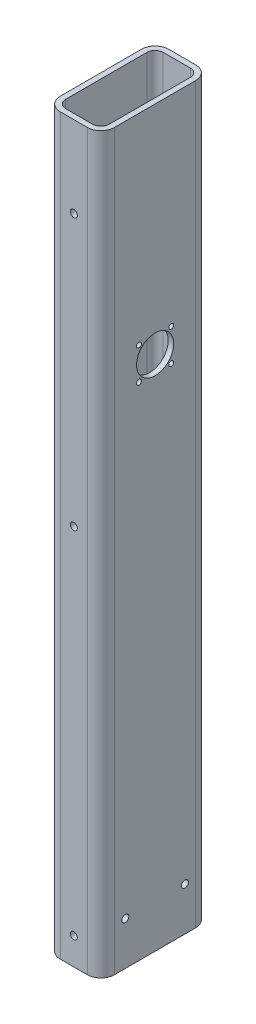
ISO-10303-21;
HEADER;
FILE_DESCRIPTION(('STEP AP214'),'2;1');
FILE_NAME('part.step','',(''),(''),'','','');
FILE_SCHEMA(('AUTOMOTIVE_DESIGN { 1 0 10303 214 1 1 1 1 }'));
ENDSEC;
DATA;
#1=APPLICATION_CONTEXT('core data for automotive mechanical design processes');
#2=APPLICATION_PROTOCOL_DEFINITION('international standard','automotive_design',2000,#1);
#3=PRODUCT_CONTEXT('',#1,'mechanical');
#4=PRODUCT('Part','Part','',(#3));
#5=PRODUCT_RELATED_PRODUCT_CATEGORY('part','',(#4));
#6=PRODUCT_DEFINITION_FORMATION('','',#4);
#7=PRODUCT_DEFINITION_CONTEXT('part definition',#1,'design');
#8=PRODUCT_DEFINITION('design','',#6,#7);
#9=PRODUCT_DEFINITION_SHAPE('','',#8);
#10=(LENGTH_UNIT() NAMED_UNIT(*) SI_UNIT(.MILLI.,.METRE.));
#11=(NAMED_UNIT(*) PLANE_ANGLE_UNIT() SI_UNIT($,.RADIAN.));
#12=(NAMED_UNIT(*) SI_UNIT($,.STERADIAN.) SOLID_ANGLE_UNIT());
#13=UNCERTAINTY_MEASURE_WITH_UNIT(LENGTH_MEASURE(1.E-05),#10,'distance_accuracy_value','');
#14=(GEOMETRIC_REPRESENTATION_CONTEXT(3) GLOBAL_UNCERTAINTY_ASSIGNED_CONTEXT((#13)) GLOBAL_UNIT_ASSIGNED_CONTEXT((#10,
#11,#12)) REPRESENTATION_CONTEXT('',''));
#15=CARTESIAN_POINT('',(0.,0.,0.));
#16=DIRECTION('',(0.,0.,1.));
#17=DIRECTION('',(1.,0.,0.));
#18=AXIS2_PLACEMENT_3D('',#15,#16,#17);
#19=CARTESIAN_POINT('',(12.4999999999999,338.5,37.5));
#20=DIRECTION('',(0.,-1.,0.));
#21=DIRECTION('',(1.,0.,0.));
#22=AXIS2_PLACEMENT_3D('',#19,#20,#21);
#23=CYLINDRICAL_SURFACE('',#22,7.5);
#24=CARTESIAN_POINT('',(12.5,-338.5,37.5));
#25=DIRECTION('',(0.,1.,0.));
#26=DIRECTION('',(1.,0.,0.));
#27=AXIS2_PLACEMENT_3D('',#24,#25,#26);
#28=CIRCLE('',#27,7.5);
#29=CARTESIAN_POINT('',(12.5,-338.5,45.));
#30=VERTEX_POINT('',#29);
#31=CARTESIAN_POINT('',(20.,-338.5,37.5));
#32=VERTEX_POINT('',#31);
#33=EDGE_CURVE('E229',#30,#32,#28,.T.);
#34=ORIENTED_EDGE('',*,*,#33,.F.);
#35=DIRECTION('',(0.,-1.,0.));
#36=VECTOR('',#35,1.);
#37=CARTESIAN_POINT('',(12.4999999999999,338.5,45.));
#38=LINE('',#37,#36);
#39=CARTESIAN_POINT('',(12.4999999999999,338.5,45.));
#40=VERTEX_POINT('',#39);
#41=EDGE_CURVE('E12',#40,#30,#38,.T.);
#42=ORIENTED_EDGE('',*,*,#41,.F.);
#43=CARTESIAN_POINT('',(12.4999999999999,338.5,37.5));
#44=DIRECTION('',(0.,1.,0.));
#45=DIRECTION('',(1.,0.,0.));
#46=AXIS2_PLACEMENT_3D('',#43,#44,#45);
#47=CIRCLE('',#46,7.5);
#48=CARTESIAN_POINT('',(19.9999999999999,338.5,37.5));
#49=VERTEX_POINT('',#48);
#50=EDGE_CURVE('E380',#40,#49,#47,.T.);
#51=ORIENTED_EDGE('',*,*,#50,.T.);
#52=DIRECTION('',(0.,-1.,0.));
#53=VECTOR('',#52,1.);
#54=CARTESIAN_POINT('',(19.9999999999999,338.5,37.5));
#55=LINE('',#54,#53);
#56=EDGE_CURVE('E80',#49,#32,#55,.T.);
#57=ORIENTED_EDGE('',*,*,#56,.T.);
#58=EDGE_LOOP('',(#34,#42,#51,#57));
#59=FACE_BOUND('',#58,.T.);
#60=ADVANCED_FACE('F61',(#59),#23,.F.);
#61=CARTESIAN_POINT('',(12.4999999999999,338.5,45.));
#62=DIRECTION('',(0.,0.,-1.));
#63=DIRECTION('',(-1.,0.,0.));
#64=AXIS2_PLACEMENT_3D('',#61,#62,#63);
#65=PLANE('',#64);
#66=CARTESIAN_POINT('',(0.,-313.5,45.));
#67=DIRECTION('',(0.,0.,-1.));
#68=DIRECTION('',(-1.,0.,0.));
#69=AXIS2_PLACEMENT_3D('',#66,#67,#68);
#70=CIRCLE('',#69,3.25);
#71=CARTESIAN_POINT('',(-3.25,-313.5,45.));
#72=VERTEX_POINT('',#71);
#73=EDGE_CURVE('E315',#72,#72,#70,.T.);
#74=ORIENTED_EDGE('',*,*,#73,.F.);
#75=EDGE_LOOP('',(#74));
#76=FACE_BOUND('',#75,.T.);
#77=CARTESIAN_POINT('',(0.,263.5,45.));
#78=DIRECTION('',(0.,0.,-1.));
#79=DIRECTION('',(-1.,0.,0.));
#80=AXIS2_PLACEMENT_3D('',#77,#78,#79);
#81=CIRCLE('',#80,3.25);
#82=CARTESIAN_POINT('',(-3.25,263.5,45.));
#83=VERTEX_POINT('',#82);
#84=EDGE_CURVE('E215',#83,#83,#81,.T.);
#85=ORIENTED_EDGE('',*,*,#84,.F.);
#86=EDGE_LOOP('',(#85));
#87=FACE_BOUND('',#86,.T.);
#88=CARTESIAN_POINT('',(0.,13.5,45.));
#89=DIRECTION('',(0.,0.,-1.));
#90=DIRECTION('',(-1.,0.,0.));
#91=AXIS2_PLACEMENT_3D('',#88,#89,#90);
#92=CIRCLE('',#91,3.25);
#93=CARTESIAN_POINT('',(-3.25,13.5,45.));
#94=VERTEX_POINT('',#93);
#95=EDGE_CURVE('E358',#94,#94,#92,.T.);
#96=ORIENTED_EDGE('',*,*,#95,.F.);
#97=EDGE_LOOP('',(#96));
#98=FACE_BOUND('',#97,.T.);
#99=DIRECTION('',(1.,0.,0.));
#100=VECTOR('',#99,1.);
#101=CARTESIAN_POINT('',(12.5,-338.5,45.));
#102=LINE('',#101,#100);
#103=CARTESIAN_POINT('',(-12.5,-338.5,45.));
#104=VERTEX_POINT('',#103);
#105=EDGE_CURVE('E231',#104,#30,#102,.T.);
#106=ORIENTED_EDGE('',*,*,#105,.F.);
#107=DIRECTION('',(0.,-1.,0.));
#108=VECTOR('',#107,1.);
#109=CARTESIAN_POINT('',(-12.5000000000001,338.5,45.));
#110=LINE('',#109,#108);
#111=CARTESIAN_POINT('',(-12.5000000000001,338.5,45.));
#112=VERTEX_POINT('',#111);
#113=EDGE_CURVE('E71',#112,#104,#110,.T.);
#114=ORIENTED_EDGE('',*,*,#113,.F.);
#115=DIRECTION('',(1.,0.,0.));
#116=VECTOR('',#115,1.);
#117=CARTESIAN_POINT('',(12.4999999999999,338.5,45.));
#118=LINE('',#117,#116);
#119=EDGE_CURVE('E382',#112,#40,#118,.T.);
#120=ORIENTED_EDGE('',*,*,#119,.T.);
#121=ORIENTED_EDGE('',*,*,#41,.T.);
#122=EDGE_LOOP('',(#106,#114,#120,#121));
#123=FACE_BOUND('',#122,.T.);
#124=ADVANCED_FACE('F417',(#76,#87,#98,#123),#65,.T.);
#125=CARTESIAN_POINT('',(-12.5000000000001,338.5,37.5));
#126=DIRECTION('',(0.,-1.,0.));
#127=DIRECTION('',(1.,0.,0.));
#128=AXIS2_PLACEMENT_3D('',#125,#126,#127);
#129=CYLINDRICAL_SURFACE('',#128,7.5);
#130=CARTESIAN_POINT('',(-12.5,-338.5,37.5));
#131=DIRECTION('',(0.,1.,0.));
#132=DIRECTION('',(1.,0.,0.));
#133=AXIS2_PLACEMENT_3D('',#130,#131,#132);
#134=CIRCLE('',#133,7.5);
#135=CARTESIAN_POINT('',(-20.,-338.5,37.5));
#136=VERTEX_POINT('',#135);
#137=EDGE_CURVE('E234',#136,#104,#134,.T.);
#138=ORIENTED_EDGE('',*,*,#137,.F.);
#139=DIRECTION('',(0.,-1.,0.));
#140=VECTOR('',#139,1.);
#141=CARTESIAN_POINT('',(-20.0000000000001,338.5,37.5));
#142=LINE('',#141,#140);
#143=CARTESIAN_POINT('',(-20.0000000000001,338.5,37.5));
#144=VERTEX_POINT('',#143);
#145=EDGE_CURVE('E256',#144,#136,#142,.T.);
#146=ORIENTED_EDGE('',*,*,#145,.F.);
#147=CARTESIAN_POINT('',(-12.5000000000001,338.5,37.5));
#148=DIRECTION('',(0.,1.,0.));
#149=DIRECTION('',(1.,0.,0.));
#150=AXIS2_PLACEMENT_3D('',#147,#148,#149);
#151=CIRCLE('',#150,7.5);
#152=EDGE_CURVE('E385',#144,#112,#151,.T.);
#153=ORIENTED_EDGE('',*,*,#152,.T.);
#154=ORIENTED_EDGE('',*,*,#113,.T.);
#155=EDGE_LOOP('',(#138,#146,#153,#154));
#156=FACE_BOUND('',#155,.T.);
#157=ADVANCED_FACE('F423',(#156),#129,.F.);
#158=CARTESIAN_POINT('',(-20.0000000000001,338.5,-37.5));
#159=DIRECTION('',(1.,0.,0.));
#160=DIRECTION('',(0.,1.,0.));
#161=AXIS2_PLACEMENT_3D('',#158,#159,#160);
#162=PLANE('',#161);
#163=CARTESIAN_POINT('',(-20.,-298.5,-27.5));
#164=DIRECTION('',(1.,0.,0.));
#165=DIRECTION('',(0.,1.,0.));
#166=AXIS2_PLACEMENT_3D('',#163,#164,#165);
#167=CIRCLE('',#166,3.25);
#168=CARTESIAN_POINT('',(-20.,-295.25,-27.5));
#169=VERTEX_POINT('',#168);
#170=EDGE_CURVE('E323',#169,#169,#167,.T.);
#171=ORIENTED_EDGE('',*,*,#170,.F.);
#172=EDGE_LOOP('',(#171));
#173=FACE_BOUND('',#172,.T.);
#174=CARTESIAN_POINT('',(-20.,-298.5,27.5));
#175=DIRECTION('',(1.,0.,0.));
#176=DIRECTION('',(0.,1.,0.));
#177=AXIS2_PLACEMENT_3D('',#174,#175,#176);
#178=CIRCLE('',#177,3.25);
#179=CARTESIAN_POINT('',(-20.,-295.25,27.5));
#180=VERTEX_POINT('',#179);
#181=EDGE_CURVE('E300',#180,#180,#178,.T.);
#182=ORIENTED_EDGE('',*,*,#181,.F.);
#183=EDGE_LOOP('',(#182));
#184=FACE_BOUND('',#183,.T.);
#185=CARTESIAN_POINT('',(-20.0000000000001,138.5,0.));
#186=DIRECTION('',(1.,0.,0.));
#187=DIRECTION('',(0.,1.,0.));
#188=AXIS2_PLACEMENT_3D('',#185,#186,#187);
#189=CIRCLE('',#188,22.5);
#190=CARTESIAN_POINT('',(-20.0000000000001,161.,0.));
#191=VERTEX_POINT('',#190);
#192=EDGE_CURVE('E339',#191,#191,#189,.T.);
#193=ORIENTED_EDGE('',*,*,#192,.F.);
#194=EDGE_LOOP('',(#193));
#195=FACE_BOUND('',#194,.T.);
#196=DIRECTION('',(0.,0.,1.));
#197=VECTOR('',#196,1.);
#198=CARTESIAN_POINT('',(-20.,-338.5,-37.5));
#199=LINE('',#198,#197);
#200=CARTESIAN_POINT('',(-20.,-338.5,-37.5));
#201=VERTEX_POINT('',#200);
#202=EDGE_CURVE('E237',#201,#136,#199,.T.);
#203=ORIENTED_EDGE('',*,*,#202,.F.);
#204=DIRECTION('',(0.,-1.,0.));
#205=VECTOR('',#204,1.);
#206=CARTESIAN_POINT('',(-20.0000000000001,338.5,-37.5));
#207=LINE('',#206,#205);
#208=CARTESIAN_POINT('',(-20.0000000000001,338.5,-37.5));
#209=VERTEX_POINT('',#208);
#210=EDGE_CURVE('E254',#209,#201,#207,.T.);
#211=ORIENTED_EDGE('',*,*,#210,.F.);
#212=DIRECTION('',(0.,0.,1.));
#213=VECTOR('',#212,1.);
#214=CARTESIAN_POINT('',(-20.0000000000001,338.5,-37.5));
#215=LINE('',#214,#213);
#216=EDGE_CURVE('E388',#209,#144,#215,.T.);
#217=ORIENTED_EDGE('',*,*,#216,.T.);
#218=ORIENTED_EDGE('',*,*,#145,.T.);
#219=EDGE_LOOP('',(#203,#211,#217,#218));
#220=FACE_BOUND('',#219,.T.);
#221=ADVANCED_FACE('F571',(#173,#184,#195,#220),#162,.T.);
#222=CARTESIAN_POINT('',(-12.5000000000001,338.5,-37.5));
#223=DIRECTION('',(0.,-1.,0.));
#224=DIRECTION('',(1.,0.,0.));
#225=AXIS2_PLACEMENT_3D('',#222,#223,#224);
#226=CYLINDRICAL_SURFACE('',#225,7.5);
#227=CARTESIAN_POINT('',(-12.5,-338.5,-37.5));
#228=DIRECTION('',(0.,1.,0.));
#229=DIRECTION('',(-1.,0.,0.));
#230=AXIS2_PLACEMENT_3D('',#227,#228,#229);
#231=CIRCLE('',#230,7.5);
#232=CARTESIAN_POINT('',(-12.5,-338.5,-45.));
#233=VERTEX_POINT('',#232);
#234=EDGE_CURVE('E240',#233,#201,#231,.T.);
#235=ORIENTED_EDGE('',*,*,#234,.F.);
#236=DIRECTION('',(0.,-1.,0.));
#237=VECTOR('',#236,1.);
#238=CARTESIAN_POINT('',(-12.5000000000001,338.5,-45.));
#239=LINE('',#238,#237);
#240=CARTESIAN_POINT('',(-12.5000000000001,338.5,-45.));
#241=VERTEX_POINT('',#240);
#242=EDGE_CURVE('E191',#241,#233,#239,.T.);
#243=ORIENTED_EDGE('',*,*,#242,.F.);
#244=CARTESIAN_POINT('',(-12.5000000000001,338.5,-37.5));
#245=DIRECTION('',(0.,1.,0.));
#246=DIRECTION('',(-1.,0.,0.));
#247=AXIS2_PLACEMENT_3D('',#244,#245,#246);
#248=CIRCLE('',#247,7.5);
#249=EDGE_CURVE('E202',#241,#209,#248,.T.);
#250=ORIENTED_EDGE('',*,*,#249,.T.);
#251=ORIENTED_EDGE('',*,*,#210,.T.);
#252=EDGE_LOOP('',(#235,#243,#250,#251));
#253=FACE_BOUND('',#252,.T.);
#254=ADVANCED_FACE('F392',(#253),#226,.F.);
#255=CARTESIAN_POINT('',(12.4999999999999,338.5,-45.));
#256=DIRECTION('',(0.,0.,1.));
#257=DIRECTION('',(1.,0.,0.));
#258=AXIS2_PLACEMENT_3D('',#255,#256,#257);
#259=PLANE('',#258);
#260=CARTESIAN_POINT('',(0.,-313.5,-45.));
#261=DIRECTION('',(0.,0.,1.));
#262=DIRECTION('',(1.,0.,0.));
#263=AXIS2_PLACEMENT_3D('',#260,#261,#262);
#264=CIRCLE('',#263,3.25);
#265=CARTESIAN_POINT('',(3.25,-313.5,-45.));
#266=VERTEX_POINT('',#265);
#267=EDGE_CURVE('E549',#266,#266,#264,.T.);
#268=ORIENTED_EDGE('',*,*,#267,.F.);
#269=EDGE_LOOP('',(#268));
#270=FACE_BOUND('',#269,.T.);
#271=CARTESIAN_POINT('',(0.,263.5,-45.));
#272=DIRECTION('',(0.,0.,1.));
#273=DIRECTION('',(1.,0.,0.));
#274=AXIS2_PLACEMENT_3D('',#271,#272,#273);
#275=CIRCLE('',#274,3.25);
#276=CARTESIAN_POINT('',(3.25,263.5,-45.));
#277=VERTEX_POINT('',#276);
#278=EDGE_CURVE('E361',#277,#277,#275,.T.);
#279=ORIENTED_EDGE('',*,*,#278,.F.);
#280=EDGE_LOOP('',(#279));
#281=FACE_BOUND('',#280,.T.);
#282=CARTESIAN_POINT('',(0.,13.5,-45.));
#283=DIRECTION('',(0.,0.,1.));
#284=DIRECTION('',(1.,0.,0.));
#285=AXIS2_PLACEMENT_3D('',#282,#283,#284);
#286=CIRCLE('',#285,3.25);
#287=CARTESIAN_POINT('',(3.25,13.5,-45.));
#288=VERTEX_POINT('',#287);
#289=EDGE_CURVE('E347',#288,#288,#286,.T.);
#290=ORIENTED_EDGE('',*,*,#289,.F.);
#291=EDGE_LOOP('',(#290));
#292=FACE_BOUND('',#291,.T.);
#293=DIRECTION('',(-1.,0.,0.));
#294=VECTOR('',#293,1.);
#295=CARTESIAN_POINT('',(12.5,-338.5,-45.));
#296=LINE('',#295,#294);
#297=CARTESIAN_POINT('',(12.5,-338.5,-45.));
#298=VERTEX_POINT('',#297);
#299=EDGE_CURVE('E187',#298,#233,#296,.T.);
#300=ORIENTED_EDGE('',*,*,#299,.F.);
#301=DIRECTION('',(0.,-1.,0.));
#302=VECTOR('',#301,1.);
#303=CARTESIAN_POINT('',(12.4999999999999,338.5,-45.));
#304=LINE('',#303,#302);
#305=CARTESIAN_POINT('',(12.4999999999999,338.5,-45.));
#306=VERTEX_POINT('',#305);
#307=EDGE_CURVE('E182',#306,#298,#304,.T.);
#308=ORIENTED_EDGE('',*,*,#307,.F.);
#309=DIRECTION('',(-1.,0.,0.));
#310=VECTOR('',#309,1.);
#311=CARTESIAN_POINT('',(12.4999999999999,338.5,-45.));
#312=LINE('',#311,#310);
#313=EDGE_CURVE('E185',#306,#241,#312,.T.);
#314=ORIENTED_EDGE('',*,*,#313,.T.);
#315=ORIENTED_EDGE('',*,*,#242,.T.);
#316=EDGE_LOOP('',(#300,#308,#314,#315));
#317=FACE_BOUND('',#316,.T.);
#318=ADVANCED_FACE('F184',(#270,#281,#292,#317),#259,.T.);
#319=CARTESIAN_POINT('',(12.4999999999999,338.5,-37.5));
#320=DIRECTION('',(0.,-1.,0.));
#321=DIRECTION('',(1.,0.,0.));
#322=AXIS2_PLACEMENT_3D('',#319,#320,#321);
#323=CYLINDRICAL_SURFACE('',#322,7.5);
#324=CARTESIAN_POINT('',(12.5,-338.5,-37.5));
#325=DIRECTION('',(0.,1.,0.));
#326=DIRECTION('',(1.,0.,0.));
#327=AXIS2_PLACEMENT_3D('',#324,#325,#326);
#328=CIRCLE('',#327,7.5);
#329=CARTESIAN_POINT('',(20.,-338.5,-37.5));
#330=VERTEX_POINT('',#329);
#331=EDGE_CURVE('E244',#330,#298,#328,.T.);
#332=ORIENTED_EDGE('',*,*,#331,.F.);
#333=DIRECTION('',(0.,-1.,0.));
#334=VECTOR('',#333,1.);
#335=CARTESIAN_POINT('',(19.9999999999999,338.5,-37.5));
#336=LINE('',#335,#334);
#337=CARTESIAN_POINT('',(19.9999999999999,338.5,-37.5));
#338=VERTEX_POINT('',#337);
#339=EDGE_CURVE('E129',#338,#330,#336,.T.);
#340=ORIENTED_EDGE('',*,*,#339,.F.);
#341=CARTESIAN_POINT('',(12.4999999999999,338.5,-37.5));
#342=DIRECTION('',(0.,1.,0.));
#343=DIRECTION('',(1.,0.,0.));
#344=AXIS2_PLACEMENT_3D('',#341,#342,#343);
#345=CIRCLE('',#344,7.5);
#346=EDGE_CURVE('E199',#338,#306,#345,.T.);
#347=ORIENTED_EDGE('',*,*,#346,.T.);
#348=ORIENTED_EDGE('',*,*,#307,.T.);
#349=EDGE_LOOP('',(#332,#340,#347,#348));
#350=FACE_BOUND('',#349,.T.);
#351=ADVANCED_FACE('F204',(#350),#323,.F.);
#352=CARTESIAN_POINT('',(12.4999999999999,338.5,37.5));
#353=DIRECTION('',(0.,-1.,0.));
#354=DIRECTION('',(1.,0.,0.));
#355=AXIS2_PLACEMENT_3D('',#352,#353,#354);
#356=CYLINDRICAL_SURFACE('',#355,12.5);
#357=CARTESIAN_POINT('',(12.5,-338.5,37.5));
#358=DIRECTION('',(0.,1.,0.));
#359=DIRECTION('',(1.,0.,0.));
#360=AXIS2_PLACEMENT_3D('',#357,#358,#359);
#361=CIRCLE('',#360,12.5);
#362=CARTESIAN_POINT('',(12.5,-338.5,50.));
#363=VERTEX_POINT('',#362);
#364=CARTESIAN_POINT('',(25.,-338.5,37.5));
#365=VERTEX_POINT('',#364);
#366=EDGE_CURVE('E211',#363,#365,#361,.T.);
#367=ORIENTED_EDGE('',*,*,#366,.T.);
#368=DIRECTION('',(0.,-1.,0.));
#369=VECTOR('',#368,1.);
#370=CARTESIAN_POINT('',(24.9999999999999,338.5,37.5));
#371=LINE('',#370,#369);
#372=CARTESIAN_POINT('',(24.9999999999999,338.5,37.5));
#373=VERTEX_POINT('',#372);
#374=EDGE_CURVE('E251',#373,#365,#371,.T.);
#375=ORIENTED_EDGE('',*,*,#374,.F.);
#376=CARTESIAN_POINT('',(12.4999999999999,338.5,37.5));
#377=DIRECTION('',(0.,1.,0.));
#378=DIRECTION('',(1.,0.,0.));
#379=AXIS2_PLACEMENT_3D('',#376,#377,#378);
#380=CIRCLE('',#379,12.5);
#381=CARTESIAN_POINT('',(12.4999999999999,338.5,50.));
#382=VERTEX_POINT('',#381);
#383=EDGE_CURVE('E249',#382,#373,#380,.T.);
#384=ORIENTED_EDGE('',*,*,#383,.F.);
#385=DIRECTION('',(0.,-1.,0.));
#386=VECTOR('',#385,1.);
#387=CARTESIAN_POINT('',(12.4999999999999,338.5,50.));
#388=LINE('',#387,#386);
#389=EDGE_CURVE('E207',#382,#363,#388,.T.);
#390=ORIENTED_EDGE('',*,*,#389,.T.);
#391=EDGE_LOOP('',(#367,#375,#384,#390));
#392=FACE_BOUND('',#391,.T.);
#393=ADVANCED_FACE('F63',(#392),#356,.T.);
#394=CARTESIAN_POINT('',(24.9999999999999,338.5,-37.5));
#395=DIRECTION('',(-1.,0.,0.));
#396=DIRECTION('',(0.,-1.,0.));
#397=AXIS2_PLACEMENT_3D('',#394,#395,#396);
#398=PLANE('',#397);
#399=CARTESIAN_POINT('',(25.0000000000001,-298.5,-27.5));
#400=DIRECTION('',(-1.,0.,0.));
#401=DIRECTION('',(0.,-1.,0.));
#402=AXIS2_PLACEMENT_3D('',#399,#400,#401);
#403=CIRCLE('',#402,3.25);
#404=CARTESIAN_POINT('',(25.0000000000001,-301.75,-27.5));
#405=VERTEX_POINT('',#404);
#406=EDGE_CURVE('E301',#405,#405,#403,.T.);
#407=ORIENTED_EDGE('',*,*,#406,.T.);
#408=EDGE_LOOP('',(#407));
#409=FACE_BOUND('',#408,.T.);
#410=CARTESIAN_POINT('',(25.0000000000001,-298.5,27.5));
#411=DIRECTION('',(-1.,0.,0.));
#412=DIRECTION('',(0.,-1.,0.));
#413=AXIS2_PLACEMENT_3D('',#410,#411,#412);
#414=CIRCLE('',#413,3.25);
#415=CARTESIAN_POINT('',(25.0000000000001,-301.75,27.5));
#416=VERTEX_POINT('',#415);
#417=EDGE_CURVE('E312',#416,#416,#414,.T.);
#418=ORIENTED_EDGE('',*,*,#417,.T.);
#419=EDGE_LOOP('',(#418));
#420=FACE_BOUND('',#419,.T.);
#421=CARTESIAN_POINT('',(24.9999999999999,123.650757595083,-14.8492424049175));
#422=DIRECTION('',(1.,0.,0.));
#423=DIRECTION('',(0.,1.,0.));
#424=AXIS2_PLACEMENT_3D('',#421,#422,#423);
#425=CIRCLE('',#424,2.25);
#426=CARTESIAN_POINT('',(24.9999999999999,125.900757595083,-14.8492424049175));
#427=VERTEX_POINT('',#426);
#428=EDGE_CURVE('E326',#427,#427,#425,.T.);
#429=ORIENTED_EDGE('',*,*,#428,.F.);
#430=EDGE_LOOP('',(#429));
#431=FACE_BOUND('',#430,.T.);
#432=CARTESIAN_POINT('',(24.9999999999999,123.650757595083,14.8492424049174));
#433=DIRECTION('',(1.,0.,0.));
#434=DIRECTION('',(0.,1.,0.));
#435=AXIS2_PLACEMENT_3D('',#432,#433,#434);
#436=CIRCLE('',#435,2.25);
#437=CARTESIAN_POINT('',(24.9999999999999,125.900757595083,14.8492424049174));
#438=VERTEX_POINT('',#437);
#439=EDGE_CURVE('E330',#438,#438,#436,.T.);
#440=ORIENTED_EDGE('',*,*,#439,.F.);
#441=EDGE_LOOP('',(#440));
#442=FACE_BOUND('',#441,.T.);
#443=CARTESIAN_POINT('',(24.9999999999999,153.349242404917,14.8492424049174));
#444=DIRECTION('',(1.,0.,0.));
#445=DIRECTION('',(0.,1.,0.));
#446=AXIS2_PLACEMENT_3D('',#443,#444,#445);
#447=CIRCLE('',#446,2.25);
#448=CARTESIAN_POINT('',(24.9999999999999,155.599242404917,14.8492424049174));
#449=VERTEX_POINT('',#448);
#450=EDGE_CURVE('E327',#449,#449,#447,.T.);
#451=ORIENTED_EDGE('',*,*,#450,.F.);
#452=EDGE_LOOP('',(#451));
#453=FACE_BOUND('',#452,.T.);
#454=CARTESIAN_POINT('',(24.9999999999999,153.349242404917,-14.8492424049175));
#455=DIRECTION('',(1.,0.,0.));
#456=DIRECTION('',(0.,1.,0.));
#457=AXIS2_PLACEMENT_3D('',#454,#455,#456);
#458=CIRCLE('',#457,2.25);
#459=CARTESIAN_POINT('',(24.9999999999999,155.599242404917,-14.8492424049175));
#460=VERTEX_POINT('',#459);
#461=EDGE_CURVE('E289',#460,#460,#458,.T.);
#462=ORIENTED_EDGE('',*,*,#461,.F.);
#463=EDGE_LOOP('',(#462));
#464=FACE_BOUND('',#463,.T.);
#465=CARTESIAN_POINT('',(24.9999999999999,138.5,0.));
#466=DIRECTION('',(1.,0.,0.));
#467=DIRECTION('',(0.,1.,0.));
#468=AXIS2_PLACEMENT_3D('',#465,#466,#467);
#469=CIRCLE('',#468,17.1);
#470=CARTESIAN_POINT('',(24.9999999999999,155.6,0.));
#471=VERTEX_POINT('',#470);
#472=EDGE_CURVE('E284',#471,#471,#469,.T.);
#473=ORIENTED_EDGE('',*,*,#472,.F.);
#474=EDGE_LOOP('',(#473));
#475=FACE_BOUND('',#474,.T.);
#476=DIRECTION('',(0.,0.,-1.));
#477=VECTOR('',#476,1.);
#478=CARTESIAN_POINT('',(25.,-338.5,-37.5));
#479=LINE('',#478,#477);
#480=CARTESIAN_POINT('',(25.,-338.5,-37.5));
#481=VERTEX_POINT('',#480);
#482=EDGE_CURVE('E214',#365,#481,#479,.T.);
#483=ORIENTED_EDGE('',*,*,#482,.T.);
#484=DIRECTION('',(0.,-1.,0.));
#485=VECTOR('',#484,1.);
#486=CARTESIAN_POINT('',(24.9999999999999,338.5,-37.5));
#487=LINE('',#486,#485);
#488=CARTESIAN_POINT('',(24.9999999999999,338.5,-37.5));
#489=VERTEX_POINT('',#488);
#490=EDGE_CURVE('E276',#489,#481,#487,.T.);
#491=ORIENTED_EDGE('',*,*,#490,.F.);
#492=DIRECTION('',(0.,0.,-1.));
#493=VECTOR('',#492,1.);
#494=CARTESIAN_POINT('',(24.9999999999999,338.5,-37.5));
#495=LINE('',#494,#493);
#496=EDGE_CURVE('E142',#373,#489,#495,.T.);
#497=ORIENTED_EDGE('',*,*,#496,.F.);
#498=ORIENTED_EDGE('',*,*,#374,.T.);
#499=EDGE_LOOP('',(#483,#491,#497,#498));
#500=FACE_BOUND('',#499,.T.);
#501=ADVANCED_FACE('F444',(#409,#420,#431,#442,#453,#464,#475,#500),#398,.F.);
#502=CARTESIAN_POINT('',(12.4999999999999,338.5,-37.5));
#503=DIRECTION('',(0.,-1.,0.));
#504=DIRECTION('',(1.,0.,0.));
#505=AXIS2_PLACEMENT_3D('',#502,#503,#504);
#506=CYLINDRICAL_SURFACE('',#505,12.5);
#507=CARTESIAN_POINT('',(12.5,-338.5,-37.5));
#508=DIRECTION('',(0.,1.,0.));
#509=DIRECTION('',(1.,0.,0.));
#510=AXIS2_PLACEMENT_3D('',#507,#508,#509);
#511=CIRCLE('',#510,12.5);
#512=CARTESIAN_POINT('',(12.5,-338.5,-50.));
#513=VERTEX_POINT('',#512);
#514=EDGE_CURVE('E217',#481,#513,#511,.T.);
#515=ORIENTED_EDGE('',*,*,#514,.T.);
#516=DIRECTION('',(0.,-1.,0.));
#517=VECTOR('',#516,1.);
#518=CARTESIAN_POINT('',(12.4999999999999,338.5,-50.));
#519=LINE('',#518,#517);
#520=CARTESIAN_POINT('',(12.4999999999999,338.5,-50.));
#521=VERTEX_POINT('',#520);
#522=EDGE_CURVE('E273',#521,#513,#519,.T.);
#523=ORIENTED_EDGE('',*,*,#522,.F.);
#524=CARTESIAN_POINT('',(12.4999999999999,338.5,-37.5));
#525=DIRECTION('',(0.,1.,0.));
#526=DIRECTION('',(1.,0.,0.));
#527=AXIS2_PLACEMENT_3D('',#524,#525,#526);
#528=CIRCLE('',#527,12.5);
#529=EDGE_CURVE('E368',#489,#521,#528,.T.);
#530=ORIENTED_EDGE('',*,*,#529,.F.);
#531=ORIENTED_EDGE('',*,*,#490,.T.);
#532=EDGE_LOOP('',(#515,#523,#530,#531));
#533=FACE_BOUND('',#532,.T.);
#534=ADVANCED_FACE('F441',(#533),#506,.T.);
#535=CARTESIAN_POINT('',(12.4999999999999,338.5,-50.));
#536=DIRECTION('',(0.,0.,1.));
#537=DIRECTION('',(1.,0.,0.));
#538=AXIS2_PLACEMENT_3D('',#535,#536,#537);
#539=PLANE('',#538);
#540=CARTESIAN_POINT('',(0.,-313.5,-50.));
#541=DIRECTION('',(0.,0.,-1.));
#542=DIRECTION('',(-1.,0.,0.));
#543=AXIS2_PLACEMENT_3D('',#540,#541,#542);
#544=CIRCLE('',#543,3.25);
#545=CARTESIAN_POINT('',(-3.25,-313.5,-50.));
#546=VERTEX_POINT('',#545);
#547=EDGE_CURVE('E552',#546,#546,#544,.T.);
#548=ORIENTED_EDGE('',*,*,#547,.F.);
#549=EDGE_LOOP('',(#548));
#550=FACE_BOUND('',#549,.T.);
#551=CARTESIAN_POINT('',(0.,263.5,-50.));
#552=DIRECTION('',(0.,0.,-1.));
#553=DIRECTION('',(-1.,0.,0.));
#554=AXIS2_PLACEMENT_3D('',#551,#552,#553);
#555=CIRCLE('',#554,3.25);
#556=CARTESIAN_POINT('',(-3.25,263.5,-50.));
#557=VERTEX_POINT('',#556);
#558=EDGE_CURVE('E348',#557,#557,#555,.T.);
#559=ORIENTED_EDGE('',*,*,#558,.F.);
#560=EDGE_LOOP('',(#559));
#561=FACE_BOUND('',#560,.T.);
#562=CARTESIAN_POINT('',(0.,13.5,-50.));
#563=DIRECTION('',(0.,0.,-1.));
#564=DIRECTION('',(-1.,0.,0.));
#565=AXIS2_PLACEMENT_3D('',#562,#563,#564);
#566=CIRCLE('',#565,3.25);
#567=CARTESIAN_POINT('',(-3.25,13.5,-50.));
#568=VERTEX_POINT('',#567);
#569=EDGE_CURVE('E283',#568,#568,#566,.T.);
#570=ORIENTED_EDGE('',*,*,#569,.F.);
#571=EDGE_LOOP('',(#570));
#572=FACE_BOUND('',#571,.T.);
#573=DIRECTION('',(-1.,0.,0.));
#574=VECTOR('',#573,1.);
#575=CARTESIAN_POINT('',(12.5,-338.5,-50.));
#576=LINE('',#575,#574);
#577=CARTESIAN_POINT('',(-12.5,-338.5,-50.));
#578=VERTEX_POINT('',#577);
#579=EDGE_CURVE('E219',#513,#578,#576,.T.);
#580=ORIENTED_EDGE('',*,*,#579,.T.);
#581=DIRECTION('',(0.,-1.,0.));
#582=VECTOR('',#581,1.);
#583=CARTESIAN_POINT('',(-12.5000000000001,338.5,-50.));
#584=LINE('',#583,#582);
#585=CARTESIAN_POINT('',(-12.5000000000001,338.5,-50.));
#586=VERTEX_POINT('',#585);
#587=EDGE_CURVE('E270',#586,#578,#584,.T.);
#588=ORIENTED_EDGE('',*,*,#587,.F.);
#589=DIRECTION('',(-1.,0.,0.));
#590=VECTOR('',#589,1.);
#591=CARTESIAN_POINT('',(12.4999999999999,338.5,-50.));
#592=LINE('',#591,#590);
#593=EDGE_CURVE('E370',#521,#586,#592,.T.);
#594=ORIENTED_EDGE('',*,*,#593,.F.);
#595=ORIENTED_EDGE('',*,*,#522,.T.);
#596=EDGE_LOOP('',(#580,#588,#594,#595));
#597=FACE_BOUND('',#596,.T.);
#598=ADVANCED_FACE('F437',(#550,#561,#572,#597),#539,.F.);
#599=CARTESIAN_POINT('',(-12.5000000000001,338.5,-37.5));
#600=DIRECTION('',(0.,-1.,0.));
#601=DIRECTION('',(1.,0.,0.));
#602=AXIS2_PLACEMENT_3D('',#599,#600,#601);
#603=CYLINDRICAL_SURFACE('',#602,12.5);
#604=CARTESIAN_POINT('',(-12.5,-338.5,-37.5));
#605=DIRECTION('',(0.,1.,0.));
#606=DIRECTION('',(-1.,0.,0.));
#607=AXIS2_PLACEMENT_3D('',#604,#605,#606);
#608=CIRCLE('',#607,12.5);
#609=CARTESIAN_POINT('',(-25.,-338.5,-37.5));
#610=VERTEX_POINT('',#609);
#611=EDGE_CURVE('E221',#578,#610,#608,.T.);
#612=ORIENTED_EDGE('',*,*,#611,.T.);
#613=DIRECTION('',(0.,-1.,0.));
#614=VECTOR('',#613,1.);
#615=CARTESIAN_POINT('',(-25.0000000000001,338.5,-37.5));
#616=LINE('',#615,#614);
#617=CARTESIAN_POINT('',(-25.0000000000001,338.5,-37.5));
#618=VERTEX_POINT('',#617);
#619=EDGE_CURVE('E267',#618,#610,#616,.T.);
#620=ORIENTED_EDGE('',*,*,#619,.F.);
#621=CARTESIAN_POINT('',(-12.5000000000001,338.5,-37.5));
#622=DIRECTION('',(0.,1.,0.));
#623=DIRECTION('',(-1.,0.,0.));
#624=AXIS2_PLACEMENT_3D('',#621,#622,#623);
#625=CIRCLE('',#624,12.5);
#626=EDGE_CURVE('E372',#586,#618,#625,.T.);
#627=ORIENTED_EDGE('',*,*,#626,.F.);
#628=ORIENTED_EDGE('',*,*,#587,.T.);
#629=EDGE_LOOP('',(#612,#620,#627,#628));
#630=FACE_BOUND('',#629,.T.);
#631=ADVANCED_FACE('F433',(#630),#603,.T.);
#632=CARTESIAN_POINT('',(-25.0000000000001,338.5,-37.5));
#633=DIRECTION('',(1.,0.,0.));
#634=DIRECTION('',(0.,1.,0.));
#635=AXIS2_PLACEMENT_3D('',#632,#633,#634);
#636=PLANE('',#635);
#637=CARTESIAN_POINT('',(-25.,-298.5,-27.5));
#638=DIRECTION('',(-1.,0.,0.));
#639=DIRECTION('',(0.,-1.,0.));
#640=AXIS2_PLACEMENT_3D('',#637,#638,#639);
#641=CIRCLE('',#640,3.25);
#642=CARTESIAN_POINT('',(-25.,-301.75,-27.5));
#643=VERTEX_POINT('',#642);
#644=EDGE_CURVE('E307',#643,#643,#641,.T.);
#645=ORIENTED_EDGE('',*,*,#644,.F.);
#646=EDGE_LOOP('',(#645));
#647=FACE_BOUND('',#646,.T.);
#648=CARTESIAN_POINT('',(-25.,-298.5,27.5));
#649=DIRECTION('',(-1.,0.,0.));
#650=DIRECTION('',(0.,-1.,0.));
#651=AXIS2_PLACEMENT_3D('',#648,#649,#650);
#652=CIRCLE('',#651,3.25);
#653=CARTESIAN_POINT('',(-25.,-301.75,27.5));
#654=VERTEX_POINT('',#653);
#655=EDGE_CURVE('E320',#654,#654,#652,.T.);
#656=ORIENTED_EDGE('',*,*,#655,.F.);
#657=EDGE_LOOP('',(#656));
#658=FACE_BOUND('',#657,.T.);
#659=CARTESIAN_POINT('',(-25.0000000000001,138.5,0.));
#660=DIRECTION('',(-1.,0.,0.));
#661=DIRECTION('',(0.,-1.,0.));
#662=AXIS2_PLACEMENT_3D('',#659,#660,#661);
#663=CIRCLE('',#662,22.5);
#664=CARTESIAN_POINT('',(-25.0000000000001,116.,0.));
#665=VERTEX_POINT('',#664);
#666=EDGE_CURVE('E297',#665,#665,#663,.T.);
#667=ORIENTED_EDGE('',*,*,#666,.F.);
#668=EDGE_LOOP('',(#667));
#669=FACE_BOUND('',#668,.T.);
#670=DIRECTION('',(0.,0.,1.));
#671=VECTOR('',#670,1.);
#672=CARTESIAN_POINT('',(-25.,-338.5,-37.5));
#673=LINE('',#672,#671);
#674=CARTESIAN_POINT('',(-25.,-338.5,37.5));
#675=VERTEX_POINT('',#674);
#676=EDGE_CURVE('E223',#610,#675,#673,.T.);
#677=ORIENTED_EDGE('',*,*,#676,.T.);
#678=DIRECTION('',(0.,-1.,0.));
#679=VECTOR('',#678,1.);
#680=CARTESIAN_POINT('',(-25.0000000000001,338.5,37.5));
#681=LINE('',#680,#679);
#682=CARTESIAN_POINT('',(-25.0000000000001,338.5,37.5));
#683=VERTEX_POINT('',#682);
#684=EDGE_CURVE('E264',#683,#675,#681,.T.);
#685=ORIENTED_EDGE('',*,*,#684,.F.);
#686=DIRECTION('',(0.,0.,1.));
#687=VECTOR('',#686,1.);
#688=CARTESIAN_POINT('',(-25.0000000000001,338.5,-37.5));
#689=LINE('',#688,#687);
#690=EDGE_CURVE('E374',#618,#683,#689,.T.);
#691=ORIENTED_EDGE('',*,*,#690,.F.);
#692=ORIENTED_EDGE('',*,*,#619,.T.);
#693=EDGE_LOOP('',(#677,#685,#691,#692));
#694=FACE_BOUND('',#693,.T.);
#695=ADVANCED_FACE('F430',(#647,#658,#669,#694),#636,.F.);
#696=CARTESIAN_POINT('',(-12.5000000000001,338.5,37.5));
#697=DIRECTION('',(0.,-1.,0.));
#698=DIRECTION('',(1.,0.,0.));
#699=AXIS2_PLACEMENT_3D('',#696,#697,#698);
#700=CYLINDRICAL_SURFACE('',#699,12.5);
#701=CARTESIAN_POINT('',(-12.5,-338.5,37.5));
#702=DIRECTION('',(0.,1.,0.));
#703=DIRECTION('',(1.,0.,0.));
#704=AXIS2_PLACEMENT_3D('',#701,#702,#703);
#705=CIRCLE('',#704,12.5);
#706=CARTESIAN_POINT('',(-12.5,-338.5,50.));
#707=VERTEX_POINT('',#706);
#708=EDGE_CURVE('E225',#675,#707,#705,.T.);
#709=ORIENTED_EDGE('',*,*,#708,.T.);
#710=DIRECTION('',(0.,-1.,0.));
#711=VECTOR('',#710,1.);
#712=CARTESIAN_POINT('',(-12.5000000000001,338.5,50.));
#713=LINE('',#712,#711);
#714=CARTESIAN_POINT('',(-12.5000000000001,338.5,50.));
#715=VERTEX_POINT('',#714);
#716=EDGE_CURVE('E261',#715,#707,#713,.T.);
#717=ORIENTED_EDGE('',*,*,#716,.F.);
#718=CARTESIAN_POINT('',(-12.5000000000001,338.5,37.5));
#719=DIRECTION('',(0.,1.,0.));
#720=DIRECTION('',(1.,0.,0.));
#721=AXIS2_PLACEMENT_3D('',#718,#719,#720);
#722=CIRCLE('',#721,12.5);
#723=EDGE_CURVE('E376',#683,#715,#722,.T.);
#724=ORIENTED_EDGE('',*,*,#723,.F.);
#725=ORIENTED_EDGE('',*,*,#684,.T.);
#726=EDGE_LOOP('',(#709,#717,#724,#725));
#727=FACE_BOUND('',#726,.T.);
#728=ADVANCED_FACE('F409',(#727),#700,.T.);
#729=CARTESIAN_POINT('',(12.4999999999999,338.5,50.));
#730=DIRECTION('',(0.,0.,-1.));
#731=DIRECTION('',(-1.,0.,0.));
#732=AXIS2_PLACEMENT_3D('',#729,#730,#731);
#733=PLANE('',#732);
#734=CARTESIAN_POINT('',(0.,-313.5,50.));
#735=DIRECTION('',(0.,0.,-1.));
#736=DIRECTION('',(-1.,0.,0.));
#737=AXIS2_PLACEMENT_3D('',#734,#735,#736);
#738=CIRCLE('',#737,3.25);
#739=CARTESIAN_POINT('',(-3.25,-313.5,50.));
#740=VERTEX_POINT('',#739);
#741=EDGE_CURVE('E553',#740,#740,#738,.T.);
#742=ORIENTED_EDGE('',*,*,#741,.T.);
#743=EDGE_LOOP('',(#742));
#744=FACE_BOUND('',#743,.T.);
#745=CARTESIAN_POINT('',(0.,263.5,50.));
#746=DIRECTION('',(0.,0.,-1.));
#747=DIRECTION('',(-1.,0.,0.));
#748=AXIS2_PLACEMENT_3D('',#745,#746,#747);
#749=CIRCLE('',#748,3.25);
#750=CARTESIAN_POINT('',(-3.25,263.5,50.));
#751=VERTEX_POINT('',#750);
#752=EDGE_CURVE('E344',#751,#751,#749,.T.);
#753=ORIENTED_EDGE('',*,*,#752,.T.);
#754=EDGE_LOOP('',(#753));
#755=FACE_BOUND('',#754,.T.);
#756=CARTESIAN_POINT('',(0.,13.5,50.));
#757=DIRECTION('',(0.,0.,-1.));
#758=DIRECTION('',(-1.,0.,0.));
#759=AXIS2_PLACEMENT_3D('',#756,#757,#758);
#760=CIRCLE('',#759,3.25);
#761=CARTESIAN_POINT('',(-3.25,13.5,50.));
#762=VERTEX_POINT('',#761);
#763=EDGE_CURVE('E351',#762,#762,#760,.T.);
#764=ORIENTED_EDGE('',*,*,#763,.T.);
#765=EDGE_LOOP('',(#764));
#766=FACE_BOUND('',#765,.T.);
#767=DIRECTION('',(1.,0.,0.));
#768=VECTOR('',#767,1.);
#769=CARTESIAN_POINT('',(12.5,-338.5,50.));
#770=LINE('',#769,#768);
#771=EDGE_CURVE('E227',#707,#363,#770,.T.);
#772=ORIENTED_EDGE('',*,*,#771,.T.);
#773=ORIENTED_EDGE('',*,*,#389,.F.);
#774=DIRECTION('',(1.,0.,0.));
#775=VECTOR('',#774,1.);
#776=CARTESIAN_POINT('',(12.4999999999999,338.5,50.));
#777=LINE('',#776,#775);
#778=EDGE_CURVE('E378',#715,#382,#777,.T.);
#779=ORIENTED_EDGE('',*,*,#778,.F.);
#780=ORIENTED_EDGE('',*,*,#716,.T.);
#781=EDGE_LOOP('',(#772,#773,#779,#780));
#782=FACE_BOUND('',#781,.T.);
#783=ADVANCED_FACE('F398',(#744,#755,#766,#782),#733,.F.);
#784=CARTESIAN_POINT('',(19.9999999999999,338.5,-37.5));
#785=DIRECTION('',(-1.,0.,0.));
#786=DIRECTION('',(0.,-1.,0.));
#787=AXIS2_PLACEMENT_3D('',#784,#785,#786);
#788=PLANE('',#787);
#789=CARTESIAN_POINT('',(20.,-298.5,-27.5));
#790=DIRECTION('',(-1.,0.,0.));
#791=DIRECTION('',(0.,-1.,0.));
#792=AXIS2_PLACEMENT_3D('',#789,#790,#791);
#793=CIRCLE('',#792,3.25);
#794=CARTESIAN_POINT('',(20.,-301.75,-27.5));
#795=VERTEX_POINT('',#794);
#796=EDGE_CURVE('E65',#795,#795,#793,.T.);
#797=ORIENTED_EDGE('',*,*,#796,.F.);
#798=EDGE_LOOP('',(#797));
#799=FACE_BOUND('',#798,.T.);
#800=CARTESIAN_POINT('',(20.,-298.5,27.5));
#801=DIRECTION('',(-1.,0.,0.));
#802=DIRECTION('',(0.,-1.,0.));
#803=AXIS2_PLACEMENT_3D('',#800,#801,#802);
#804=CIRCLE('',#803,3.25);
#805=CARTESIAN_POINT('',(20.,-301.75,27.5));
#806=VERTEX_POINT('',#805);
#807=EDGE_CURVE('E298',#806,#806,#804,.T.);
#808=ORIENTED_EDGE('',*,*,#807,.F.);
#809=EDGE_LOOP('',(#808));
#810=FACE_BOUND('',#809,.T.);
#811=CARTESIAN_POINT('',(19.9999999999999,123.650757595083,-14.8492424049175));
#812=DIRECTION('',(-1.,0.,0.));
#813=DIRECTION('',(0.,-1.,0.));
#814=AXIS2_PLACEMENT_3D('',#811,#812,#813);
#815=CIRCLE('',#814,2.25);
#816=CARTESIAN_POINT('',(19.9999999999999,121.400757595083,-14.8492424049175));
#817=VERTEX_POINT('',#816);
#818=EDGE_CURVE('E295',#817,#817,#815,.T.);
#819=ORIENTED_EDGE('',*,*,#818,.F.);
#820=EDGE_LOOP('',(#819));
#821=FACE_BOUND('',#820,.T.);
#822=CARTESIAN_POINT('',(19.9999999999999,123.650757595083,14.8492424049174));
#823=DIRECTION('',(-1.,0.,0.));
#824=DIRECTION('',(0.,-1.,0.));
#825=AXIS2_PLACEMENT_3D('',#822,#823,#824);
#826=CIRCLE('',#825,2.25);
#827=CARTESIAN_POINT('',(19.9999999999999,121.400757595083,14.8492424049174));
#828=VERTEX_POINT('',#827);
#829=EDGE_CURVE('E292',#828,#828,#826,.T.);
#830=ORIENTED_EDGE('',*,*,#829,.F.);
#831=EDGE_LOOP('',(#830));
#832=FACE_BOUND('',#831,.T.);
#833=CARTESIAN_POINT('',(19.9999999999999,153.349242404917,14.8492424049174));
#834=DIRECTION('',(-1.,0.,0.));
#835=DIRECTION('',(0.,-1.,0.));
#836=AXIS2_PLACEMENT_3D('',#833,#834,#835);
#837=CIRCLE('',#836,2.25);
#838=CARTESIAN_POINT('',(19.9999999999999,151.099242404917,14.8492424049174));
#839=VERTEX_POINT('',#838);
#840=EDGE_CURVE('E288',#839,#839,#837,.T.);
#841=ORIENTED_EDGE('',*,*,#840,.F.);
#842=EDGE_LOOP('',(#841));
#843=FACE_BOUND('',#842,.T.);
#844=CARTESIAN_POINT('',(19.9999999999999,153.349242404917,-14.8492424049175));
#845=DIRECTION('',(-1.,0.,0.));
#846=DIRECTION('',(0.,-1.,0.));
#847=AXIS2_PLACEMENT_3D('',#844,#845,#846);
#848=CIRCLE('',#847,2.25);
#849=CARTESIAN_POINT('',(19.9999999999999,151.099242404917,-14.8492424049175));
#850=VERTEX_POINT('',#849);
#851=EDGE_CURVE('E285',#850,#850,#848,.T.);
#852=ORIENTED_EDGE('',*,*,#851,.F.);
#853=EDGE_LOOP('',(#852));
#854=FACE_BOUND('',#853,.T.);
#855=CARTESIAN_POINT('',(19.9999999999999,138.5,0.));
#856=DIRECTION('',(-1.,0.,0.));
#857=DIRECTION('',(0.,-1.,0.));
#858=AXIS2_PLACEMENT_3D('',#855,#856,#857);
#859=CIRCLE('',#858,17.1);
#860=CARTESIAN_POINT('',(19.9999999999999,121.4,0.));
#861=VERTEX_POINT('',#860);
#862=EDGE_CURVE('E280',#861,#861,#859,.T.);
#863=ORIENTED_EDGE('',*,*,#862,.F.);
#864=EDGE_LOOP('',(#863));
#865=FACE_BOUND('',#864,.T.);
#866=DIRECTION('',(0.,0.,-1.));
#867=VECTOR('',#866,1.);
#868=CARTESIAN_POINT('',(20.,-338.5,-37.5));
#869=LINE('',#868,#867);
#870=EDGE_CURVE('E246',#32,#330,#869,.T.);
#871=ORIENTED_EDGE('',*,*,#870,.F.);
#872=ORIENTED_EDGE('',*,*,#56,.F.);
#873=DIRECTION('',(0.,0.,-1.));
#874=VECTOR('',#873,1.);
#875=CARTESIAN_POINT('',(19.9999999999999,338.5,-37.5));
#876=LINE('',#875,#874);
#877=EDGE_CURVE('E205',#49,#338,#876,.T.);
#878=ORIENTED_EDGE('',*,*,#877,.T.);
#879=ORIENTED_EDGE('',*,*,#339,.T.);
#880=EDGE_LOOP('',(#871,#872,#878,#879));
#881=FACE_BOUND('',#880,.T.);
#882=ADVANCED_FACE('F396',(#799,#810,#821,#832,#843,#854,#865,#881),#788,.T.);
#883=CARTESIAN_POINT('',(12.4999999999999,338.5,37.5));
#884=DIRECTION('',(0.,-1.,0.));
#885=DIRECTION('',(1.,0.,0.));
#886=AXIS2_PLACEMENT_3D('',#883,#884,#885);
#887=PLANE('',#886);
#888=ORIENTED_EDGE('',*,*,#383,.T.);
#889=ORIENTED_EDGE('',*,*,#496,.T.);
#890=ORIENTED_EDGE('',*,*,#529,.T.);
#891=ORIENTED_EDGE('',*,*,#593,.T.);
#892=ORIENTED_EDGE('',*,*,#626,.T.);
#893=ORIENTED_EDGE('',*,*,#690,.T.);
#894=ORIENTED_EDGE('',*,*,#723,.T.);
#895=ORIENTED_EDGE('',*,*,#778,.T.);
#896=EDGE_LOOP('',(#888,#889,#890,#891,#892,#893,#894,#895));
#897=FACE_BOUND('',#896,.T.);
#898=ORIENTED_EDGE('',*,*,#50,.F.);
#899=ORIENTED_EDGE('',*,*,#119,.F.);
#900=ORIENTED_EDGE('',*,*,#152,.F.);
#901=ORIENTED_EDGE('',*,*,#216,.F.);
#902=ORIENTED_EDGE('',*,*,#249,.F.);
#903=ORIENTED_EDGE('',*,*,#313,.F.);
#904=ORIENTED_EDGE('',*,*,#346,.F.);
#905=ORIENTED_EDGE('',*,*,#877,.F.);
#906=EDGE_LOOP('',(#898,#899,#900,#901,#902,#903,#904,#905));
#907=FACE_BOUND('',#906,.T.);
#908=ADVANCED_FACE('F197',(#897,#907),#887,.F.);
#909=CARTESIAN_POINT('',(12.5,-338.5,37.5));
#910=DIRECTION('',(0.,-1.,0.));
#911=DIRECTION('',(1.,0.,0.));
#912=AXIS2_PLACEMENT_3D('',#909,#910,#911);
#913=PLANE('',#912);
#914=ORIENTED_EDGE('',*,*,#366,.F.);
#915=ORIENTED_EDGE('',*,*,#771,.F.);
#916=ORIENTED_EDGE('',*,*,#708,.F.);
#917=ORIENTED_EDGE('',*,*,#676,.F.);
#918=ORIENTED_EDGE('',*,*,#611,.F.);
#919=ORIENTED_EDGE('',*,*,#579,.F.);
#920=ORIENTED_EDGE('',*,*,#514,.F.);
#921=ORIENTED_EDGE('',*,*,#482,.F.);
#922=EDGE_LOOP('',(#914,#915,#916,#917,#918,#919,#920,#921));
#923=FACE_BOUND('',#922,.T.);
#924=ORIENTED_EDGE('',*,*,#33,.T.);
#925=ORIENTED_EDGE('',*,*,#870,.T.);
#926=ORIENTED_EDGE('',*,*,#331,.T.);
#927=ORIENTED_EDGE('',*,*,#299,.T.);
#928=ORIENTED_EDGE('',*,*,#234,.T.);
#929=ORIENTED_EDGE('',*,*,#202,.T.);
#930=ORIENTED_EDGE('',*,*,#137,.T.);
#931=ORIENTED_EDGE('',*,*,#105,.T.);
#932=EDGE_LOOP('',(#924,#925,#926,#927,#928,#929,#930,#931));
#933=FACE_BOUND('',#932,.T.);
#934=ADVANCED_FACE('F395',(#923,#933),#913,.T.);
#935=CARTESIAN_POINT('',(0.,13.5,50.));
#936=DIRECTION('',(0.,0.,-1.));
#937=DIRECTION('',(-1.,0.,0.));
#938=AXIS2_PLACEMENT_3D('',#935,#936,#937);
#939=CYLINDRICAL_SURFACE('',#938,3.25);
#940=ORIENTED_EDGE('',*,*,#95,.T.);
#941=EDGE_LOOP('',(#940));
#942=FACE_BOUND('',#941,.T.);
#943=ORIENTED_EDGE('',*,*,#763,.F.);
#944=EDGE_LOOP('',(#943));
#945=FACE_BOUND('',#944,.T.);
#946=ADVANCED_FACE('F490',(#942,#945),#939,.F.);
#947=CARTESIAN_POINT('',(0.,263.5,50.));
#948=DIRECTION('',(0.,0.,-1.));
#949=DIRECTION('',(-1.,0.,0.));
#950=AXIS2_PLACEMENT_3D('',#947,#948,#949);
#951=CYLINDRICAL_SURFACE('',#950,3.25);
#952=ORIENTED_EDGE('',*,*,#84,.T.);
#953=EDGE_LOOP('',(#952));
#954=FACE_BOUND('',#953,.T.);
#955=ORIENTED_EDGE('',*,*,#752,.F.);
#956=EDGE_LOOP('',(#955));
#957=FACE_BOUND('',#956,.T.);
#958=ADVANCED_FACE('F494',(#954,#957),#951,.F.);
#959=ORIENTED_EDGE('',*,*,#289,.T.);
#960=EDGE_LOOP('',(#959));
#961=FACE_BOUND('',#960,.T.);
#962=ORIENTED_EDGE('',*,*,#569,.T.);
#963=EDGE_LOOP('',(#962));
#964=FACE_BOUND('',#963,.T.);
#965=ADVANCED_FACE('F497',(#961,#964),#939,.F.);
#966=ORIENTED_EDGE('',*,*,#278,.T.);
#967=EDGE_LOOP('',(#966));
#968=FACE_BOUND('',#967,.T.);
#969=ORIENTED_EDGE('',*,*,#558,.T.);
#970=EDGE_LOOP('',(#969));
#971=FACE_BOUND('',#970,.T.);
#972=ADVANCED_FACE('F500',(#968,#971),#951,.F.);
#973=CARTESIAN_POINT('',(14.9999999999999,138.5,0.));
#974=DIRECTION('',(1.,0.,0.));
#975=DIRECTION('',(0.,1.,0.));
#976=AXIS2_PLACEMENT_3D('',#973,#974,#975);
#977=CYLINDRICAL_SURFACE('',#976,17.1);
#978=ORIENTED_EDGE('',*,*,#862,.T.);
#979=EDGE_LOOP('',(#978));
#980=FACE_BOUND('',#979,.T.);
#981=ORIENTED_EDGE('',*,*,#472,.T.);
#982=EDGE_LOOP('',(#981));
#983=FACE_BOUND('',#982,.T.);
#984=ADVANCED_FACE('F504',(#980,#983),#977,.F.);
#985=CARTESIAN_POINT('',(-15.0000000000001,138.5,0.));
#986=DIRECTION('',(-1.,0.,0.));
#987=DIRECTION('',(0.,-1.,0.));
#988=AXIS2_PLACEMENT_3D('',#985,#986,#987);
#989=CYLINDRICAL_SURFACE('',#988,22.5);
#990=ORIENTED_EDGE('',*,*,#192,.T.);
#991=EDGE_LOOP('',(#990));
#992=FACE_BOUND('',#991,.T.);
#993=ORIENTED_EDGE('',*,*,#666,.T.);
#994=EDGE_LOOP('',(#993));
#995=FACE_BOUND('',#994,.T.);
#996=ADVANCED_FACE('F508',(#992,#995),#989,.F.);
#997=CARTESIAN_POINT('',(14.9999999999999,153.349242404917,-14.8492424049175));
#998=DIRECTION('',(1.,0.,0.));
#999=DIRECTION('',(0.,1.,0.));
#1000=AXIS2_PLACEMENT_3D('',#997,#998,#999);
#1001=CYLINDRICAL_SURFACE('',#1000,2.25);
#1002=ORIENTED_EDGE('',*,*,#851,.T.);
#1003=EDGE_LOOP('',(#1002));
#1004=FACE_BOUND('',#1003,.T.);
#1005=ORIENTED_EDGE('',*,*,#461,.T.);
#1006=EDGE_LOOP('',(#1005));
#1007=FACE_BOUND('',#1006,.T.);
#1008=ADVANCED_FACE('F512',(#1004,#1007),#1001,.F.);
#1009=CARTESIAN_POINT('',(14.9999999999999,153.349242404917,14.8492424049174));
#1010=DIRECTION('',(1.,0.,0.));
#1011=DIRECTION('',(0.,1.,0.));
#1012=AXIS2_PLACEMENT_3D('',#1009,#1010,#1011);
#1013=CYLINDRICAL_SURFACE('',#1012,2.25);
#1014=ORIENTED_EDGE('',*,*,#840,.T.);
#1015=EDGE_LOOP('',(#1014));
#1016=FACE_BOUND('',#1015,.T.);
#1017=ORIENTED_EDGE('',*,*,#450,.T.);
#1018=EDGE_LOOP('',(#1017));
#1019=FACE_BOUND('',#1018,.T.);
#1020=ADVANCED_FACE('F516',(#1016,#1019),#1013,.F.);
#1021=CARTESIAN_POINT('',(14.9999999999999,123.650757595083,14.8492424049174));
#1022=DIRECTION('',(1.,0.,0.));
#1023=DIRECTION('',(0.,1.,0.));
#1024=AXIS2_PLACEMENT_3D('',#1021,#1022,#1023);
#1025=CYLINDRICAL_SURFACE('',#1024,2.25);
#1026=ORIENTED_EDGE('',*,*,#829,.T.);
#1027=EDGE_LOOP('',(#1026));
#1028=FACE_BOUND('',#1027,.T.);
#1029=ORIENTED_EDGE('',*,*,#439,.T.);
#1030=EDGE_LOOP('',(#1029));
#1031=FACE_BOUND('',#1030,.T.);
#1032=ADVANCED_FACE('F522',(#1028,#1031),#1025,.F.);
#1033=CARTESIAN_POINT('',(14.9999999999999,123.650757595083,-14.8492424049175));
#1034=DIRECTION('',(1.,0.,0.));
#1035=DIRECTION('',(0.,1.,0.));
#1036=AXIS2_PLACEMENT_3D('',#1033,#1034,#1035);
#1037=CYLINDRICAL_SURFACE('',#1036,2.25);
#1038=ORIENTED_EDGE('',*,*,#818,.T.);
#1039=EDGE_LOOP('',(#1038));
#1040=FACE_BOUND('',#1039,.T.);
#1041=ORIENTED_EDGE('',*,*,#428,.T.);
#1042=EDGE_LOOP('',(#1041));
#1043=FACE_BOUND('',#1042,.T.);
#1044=ADVANCED_FACE('F518',(#1040,#1043),#1037,.F.);
#1045=CARTESIAN_POINT('',(25.0000000000001,-298.5,27.5));
#1046=DIRECTION('',(-1.,0.,0.));
#1047=DIRECTION('',(0.,-1.,0.));
#1048=AXIS2_PLACEMENT_3D('',#1045,#1046,#1047);
#1049=CYLINDRICAL_SURFACE('',#1048,3.25);
#1050=ORIENTED_EDGE('',*,*,#807,.T.);
#1051=EDGE_LOOP('',(#1050));
#1052=FACE_BOUND('',#1051,.T.);
#1053=ORIENTED_EDGE('',*,*,#417,.F.);
#1054=EDGE_LOOP('',(#1053));
#1055=FACE_BOUND('',#1054,.T.);
#1056=ADVANCED_FACE('F521',(#1052,#1055),#1049,.F.);
#1057=CARTESIAN_POINT('',(25.0000000000001,-298.5,-27.5));
#1058=DIRECTION('',(-1.,0.,0.));
#1059=DIRECTION('',(0.,-1.,0.));
#1060=AXIS2_PLACEMENT_3D('',#1057,#1058,#1059);
#1061=CYLINDRICAL_SURFACE('',#1060,3.25);
#1062=ORIENTED_EDGE('',*,*,#796,.T.);
#1063=EDGE_LOOP('',(#1062));
#1064=FACE_BOUND('',#1063,.T.);
#1065=ORIENTED_EDGE('',*,*,#406,.F.);
#1066=EDGE_LOOP('',(#1065));
#1067=FACE_BOUND('',#1066,.T.);
#1068=ADVANCED_FACE('F532',(#1064,#1067),#1061,.F.);
#1069=ORIENTED_EDGE('',*,*,#181,.T.);
#1070=EDGE_LOOP('',(#1069));
#1071=FACE_BOUND('',#1070,.T.);
#1072=ORIENTED_EDGE('',*,*,#655,.T.);
#1073=EDGE_LOOP('',(#1072));
#1074=FACE_BOUND('',#1073,.T.);
#1075=ADVANCED_FACE('F533',(#1071,#1074),#1049,.F.);
#1076=ORIENTED_EDGE('',*,*,#170,.T.);
#1077=EDGE_LOOP('',(#1076));
#1078=FACE_BOUND('',#1077,.T.);
#1079=ORIENTED_EDGE('',*,*,#644,.T.);
#1080=EDGE_LOOP('',(#1079));
#1081=FACE_BOUND('',#1080,.T.);
#1082=ADVANCED_FACE('F537',(#1078,#1081),#1061,.F.);
#1083=CARTESIAN_POINT('',(0.,-313.5,50.));
#1084=DIRECTION('',(0.,0.,-1.));
#1085=DIRECTION('',(-1.,0.,0.));
#1086=AXIS2_PLACEMENT_3D('',#1083,#1084,#1085);
#1087=CYLINDRICAL_SURFACE('',#1086,3.25);
#1088=ORIENTED_EDGE('',*,*,#73,.T.);
#1089=EDGE_LOOP('',(#1088));
#1090=FACE_BOUND('',#1089,.T.);
#1091=ORIENTED_EDGE('',*,*,#741,.F.);
#1092=EDGE_LOOP('',(#1091));
#1093=FACE_BOUND('',#1092,.T.);
#1094=ADVANCED_FACE('F540',(#1090,#1093),#1087,.F.);
#1095=ORIENTED_EDGE('',*,*,#267,.T.);
#1096=EDGE_LOOP('',(#1095));
#1097=FACE_BOUND('',#1096,.T.);
#1098=ORIENTED_EDGE('',*,*,#547,.T.);
#1099=EDGE_LOOP('',(#1098));
#1100=FACE_BOUND('',#1099,.T.);
#1101=ADVANCED_FACE('F538',(#1097,#1100),#1087,.F.);
#1102=CLOSED_SHELL('',(#60,#124,#157,#221,#254,#318,#351,#393,#501,#534,#598,#631,#695,#728,
#783,#882,#908,#934,#946,#958,#965,#972,#984,#996,#1008,#1020,#1032,#1044,#1056,#1068,#1075,
#1082,#1094,#1101));
#1103=MANIFOLD_SOLID_BREP('B2',#1102);
#1104=ADVANCED_BREP_SHAPE_REPRESENTATION('',(#18,#1103),#14);
#1105=SHAPE_DEFINITION_REPRESENTATION(#9,#1104);
ENDSEC;
END-ISO-10303-21;
